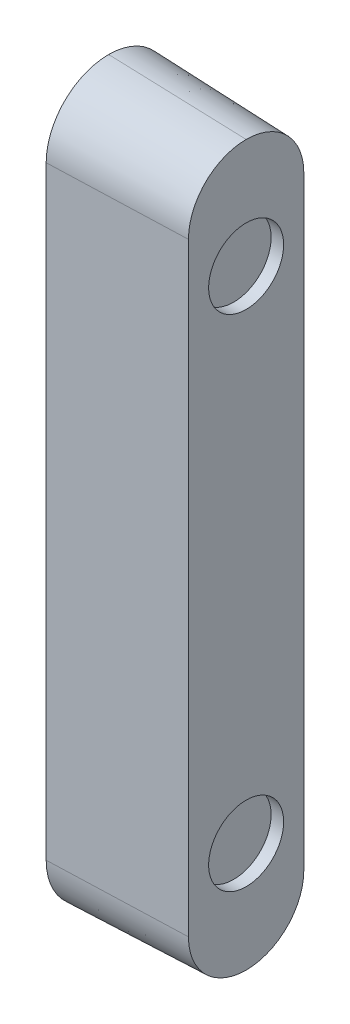
ISO-10303-21;
HEADER;
FILE_DESCRIPTION(('STEP AP214'),'2;1');
FILE_NAME('part.step','',(''),(''),'','','');
FILE_SCHEMA(('AUTOMOTIVE_DESIGN { 1 0 10303 214 1 1 1 1 }'));
ENDSEC;
DATA;
#1=APPLICATION_CONTEXT('core data for automotive mechanical design processes');
#2=APPLICATION_PROTOCOL_DEFINITION('international standard','automotive_design',2000,#1);
#3=PRODUCT_CONTEXT('',#1,'mechanical');
#4=PRODUCT('Part','Part','',(#3));
#5=PRODUCT_RELATED_PRODUCT_CATEGORY('part','',(#4));
#6=PRODUCT_DEFINITION_FORMATION('','',#4);
#7=PRODUCT_DEFINITION_CONTEXT('part definition',#1,'design');
#8=PRODUCT_DEFINITION('design','',#6,#7);
#9=PRODUCT_DEFINITION_SHAPE('','',#8);
#10=(LENGTH_UNIT() NAMED_UNIT(*) SI_UNIT(.MILLI.,.METRE.));
#11=(NAMED_UNIT(*) PLANE_ANGLE_UNIT() SI_UNIT($,.RADIAN.));
#12=(NAMED_UNIT(*) SI_UNIT($,.STERADIAN.) SOLID_ANGLE_UNIT());
#13=UNCERTAINTY_MEASURE_WITH_UNIT(LENGTH_MEASURE(1.E-05),#10,'distance_accuracy_value','');
#14=(GEOMETRIC_REPRESENTATION_CONTEXT(3) GLOBAL_UNCERTAINTY_ASSIGNED_CONTEXT((#13)) GLOBAL_UNIT_ASSIGNED_CONTEXT((#10,
#11,#12)) REPRESENTATION_CONTEXT('',''));
#15=CARTESIAN_POINT('',(0.,0.,0.));
#16=DIRECTION('',(0.,0.,1.));
#17=DIRECTION('',(1.,0.,0.));
#18=AXIS2_PLACEMENT_3D('',#15,#16,#17);
#19=CARTESIAN_POINT('',(-16.5,-87.5,-15.));
#20=DIRECTION('',(0.034899496702501,0.,-0.999390827019096));
#21=DIRECTION('',(-0.999390827019096,0.,-0.034899496702501));
#22=AXIS2_PLACEMENT_3D('',#19,#20,#21);
#23=PLANE('',#22);
#24=CARTESIAN_POINT('',(0.6,0.,-14.4028548416911));
#25=DIRECTION('',(0.034899496702501,0.,-0.999390827019096));
#26=DIRECTION('',(-0.999390827019096,0.,-0.034899496702501));
#27=AXIS2_PLACEMENT_3D('',#24,#25,#26);
#28=ELLIPSE('',#27,4.00243817719529,4.);
#29=CARTESIAN_POINT('',(-3.4,0.,-14.5425379196581));
#30=VERTEX_POINT('',#29);
#31=EDGE_CURVE('E139',#30,#30,#28,.T.);
#32=ORIENTED_EDGE('',*,*,#31,.F.);
#33=EDGE_LOOP('',(#32));
#34=FACE_BOUND('',#33,.T.);
#35=DIRECTION('',(0.,1.,0.));
#36=VECTOR('',#35,1.);
#37=CARTESIAN_POINT('',(-16.5,-87.5,-15.));
#38=LINE('',#37,#36);
#39=CARTESIAN_POINT('',(-16.5,-72.5,-15.));
#40=VERTEX_POINT('',#39);
#41=CARTESIAN_POINT('',(-16.5,72.5,-15.));
#42=VERTEX_POINT('',#41);
#43=EDGE_CURVE('E106',#40,#42,#38,.T.);
#44=ORIENTED_EDGE('',*,*,#43,.T.);
#45=DIRECTION('',(-0.999390827019096,0.,-0.034899496702501));
#46=VECTOR('',#45,1.);
#47=CARTESIAN_POINT('',(-16.5,72.5,-15.));
#48=LINE('',#47,#46);
#49=CARTESIAN_POINT('',(16.5,72.5,-13.8476146067723));
#50=VERTEX_POINT('',#49);
#51=EDGE_CURVE('E110',#42,#50,#48,.F.);
#52=ORIENTED_EDGE('',*,*,#51,.T.);
#53=DIRECTION('',(0.,1.,0.));
#54=VECTOR('',#53,1.);
#55=CARTESIAN_POINT('',(16.5,-87.5,-13.8476146067723));
#56=LINE('',#55,#54);
#57=CARTESIAN_POINT('',(16.5,-72.5,-13.8476146067723));
#58=VERTEX_POINT('',#57);
#59=EDGE_CURVE('E109',#58,#50,#56,.T.);
#60=ORIENTED_EDGE('',*,*,#59,.F.);
#61=DIRECTION('',(-0.999390827019096,0.,-0.034899496702501));
#62=VECTOR('',#61,1.);
#63=CARTESIAN_POINT('',(-16.5,-72.5,-15.));
#64=LINE('',#63,#62);
#65=EDGE_CURVE('E98',#58,#40,#64,.T.);
#66=ORIENTED_EDGE('',*,*,#65,.T.);
#67=EDGE_LOOP('',(#44,#52,#60,#66));
#68=FACE_BOUND('',#67,.T.);
#69=ADVANCED_FACE('F33',(#34,#68),#23,.T.);
#70=CARTESIAN_POINT('',(-16.5,-87.5,15.));
#71=DIRECTION('',(0.034899496702501,0.,0.999390827019096));
#72=DIRECTION('',(0.999390827019096,0.,-0.034899496702501));
#73=AXIS2_PLACEMENT_3D('',#70,#71,#72);
#74=PLANE('',#73);
#75=DIRECTION('',(0.,-1.,0.));
#76=VECTOR('',#75,1.);
#77=CARTESIAN_POINT('',(16.5,-87.5,13.8476146067723));
#78=LINE('',#77,#76);
#79=CARTESIAN_POINT('',(16.5,72.5,13.8476146067723));
#80=VERTEX_POINT('',#79);
#81=CARTESIAN_POINT('',(16.5,-72.5,13.8476146067723));
#82=VERTEX_POINT('',#81);
#83=EDGE_CURVE('E116',#80,#82,#78,.T.);
#84=ORIENTED_EDGE('',*,*,#83,.F.);
#85=DIRECTION('',(-0.999390827019096,0.,0.034899496702501));
#86=VECTOR('',#85,1.);
#87=CARTESIAN_POINT('',(-16.5,72.5,15.));
#88=LINE('',#87,#86);
#89=CARTESIAN_POINT('',(-16.5,72.5,15.));
#90=VERTEX_POINT('',#89);
#91=EDGE_CURVE('E11',#80,#90,#88,.T.);
#92=ORIENTED_EDGE('',*,*,#91,.T.);
#93=DIRECTION('',(0.,-1.,0.));
#94=VECTOR('',#93,1.);
#95=CARTESIAN_POINT('',(-16.5,-87.5,15.));
#96=LINE('',#95,#94);
#97=CARTESIAN_POINT('',(-16.5,-72.5,15.));
#98=VERTEX_POINT('',#97);
#99=EDGE_CURVE('E111',#90,#98,#96,.T.);
#100=ORIENTED_EDGE('',*,*,#99,.T.);
#101=DIRECTION('',(-0.999390827019096,0.,0.034899496702501));
#102=VECTOR('',#101,1.);
#103=CARTESIAN_POINT('',(-16.5,-72.5,15.));
#104=LINE('',#103,#102);
#105=EDGE_CURVE('E37',#98,#82,#104,.F.);
#106=ORIENTED_EDGE('',*,*,#105,.T.);
#107=EDGE_LOOP('',(#84,#92,#100,#106));
#108=FACE_BOUND('',#107,.T.);
#109=ADVANCED_FACE('F169',(#108),#74,.T.);
#110=CARTESIAN_POINT('',(-16.5,0.,0.));
#111=DIRECTION('',(-1.,0.,0.));
#112=DIRECTION('',(0.,0.,1.));
#113=AXIS2_PLACEMENT_3D('',#110,#111,#112);
#114=PLANE('',#113);
#115=CARTESIAN_POINT('',(-16.5,72.5,0.));
#116=DIRECTION('',(-1.,0.,0.));
#117=DIRECTION('',(0.,0.,1.));
#118=AXIS2_PLACEMENT_3D('',#115,#116,#117);
#119=CIRCLE('',#118,15.);
#120=CARTESIAN_POINT('',(-16.5,87.5,0.));
#121=VERTEX_POINT('',#120);
#122=EDGE_CURVE('E51',#90,#121,#119,.T.);
#123=ORIENTED_EDGE('',*,*,#122,.T.);
#124=CARTESIAN_POINT('',(-16.5,72.5,0.));
#125=DIRECTION('',(-1.,0.,0.));
#126=DIRECTION('',(0.,0.,1.));
#127=AXIS2_PLACEMENT_3D('',#124,#125,#126);
#128=CIRCLE('',#127,15.);
#129=EDGE_CURVE('E115',#121,#42,#128,.T.);
#130=ORIENTED_EDGE('',*,*,#129,.T.);
#131=ORIENTED_EDGE('',*,*,#43,.F.);
#132=CARTESIAN_POINT('',(-16.5,-72.5,0.));
#133=DIRECTION('',(-1.,0.,0.));
#134=DIRECTION('',(0.,0.,1.));
#135=AXIS2_PLACEMENT_3D('',#132,#133,#134);
#136=CIRCLE('',#135,15.);
#137=CARTESIAN_POINT('',(-16.5,-87.5,0.));
#138=VERTEX_POINT('',#137);
#139=EDGE_CURVE('E88',#40,#138,#136,.T.);
#140=ORIENTED_EDGE('',*,*,#139,.T.);
#141=CARTESIAN_POINT('',(-16.5,-72.5,0.));
#142=DIRECTION('',(-1.,0.,0.));
#143=DIRECTION('',(0.,0.,1.));
#144=AXIS2_PLACEMENT_3D('',#141,#142,#143);
#145=CIRCLE('',#144,15.);
#146=EDGE_CURVE('E100',#138,#98,#145,.T.);
#147=ORIENTED_EDGE('',*,*,#146,.T.);
#148=ORIENTED_EDGE('',*,*,#99,.F.);
#149=EDGE_LOOP('',(#123,#130,#131,#140,#147,#148));
#150=FACE_BOUND('',#149,.T.);
#151=ADVANCED_FACE('F113',(#150),#114,.T.);
#152=CARTESIAN_POINT('',(16.5,0.,0.));
#153=DIRECTION('',(-1.,0.,0.));
#154=DIRECTION('',(0.,0.,1.));
#155=AXIS2_PLACEMENT_3D('',#152,#153,#154);
#156=PLANE('',#155);
#157=CARTESIAN_POINT('',(16.5,-60.,0.));
#158=DIRECTION('',(1.,0.,0.));
#159=DIRECTION('',(0.,0.,-1.));
#160=AXIS2_PLACEMENT_3D('',#157,#158,#159);
#161=CIRCLE('',#160,9.);
#162=CARTESIAN_POINT('',(16.5,-60.,-9.));
#163=VERTEX_POINT('',#162);
#164=EDGE_CURVE('E149',#163,#163,#161,.T.);
#165=ORIENTED_EDGE('',*,*,#164,.F.);
#166=EDGE_LOOP('',(#165));
#167=FACE_BOUND('',#166,.T.);
#168=CARTESIAN_POINT('',(16.5,60.,0.));
#169=DIRECTION('',(1.,0.,0.));
#170=DIRECTION('',(0.,0.,-1.));
#171=AXIS2_PLACEMENT_3D('',#168,#169,#170);
#172=CIRCLE('',#171,9.);
#173=CARTESIAN_POINT('',(16.5,60.,-9.));
#174=VERTEX_POINT('',#173);
#175=EDGE_CURVE('E121',#174,#174,#172,.T.);
#176=ORIENTED_EDGE('',*,*,#175,.F.);
#177=EDGE_LOOP('',(#176));
#178=FACE_BOUND('',#177,.T.);
#179=ORIENTED_EDGE('',*,*,#59,.T.);
#180=CARTESIAN_POINT('',(16.5,72.5,0.));
#181=DIRECTION('',(-1.,0.,0.));
#182=DIRECTION('',(0.,0.,1.));
#183=AXIS2_PLACEMENT_3D('',#180,#181,#182);
#184=CIRCLE('',#183,13.8476146067723);
#185=CARTESIAN_POINT('',(16.5,86.3476146067723,0.));
#186=VERTEX_POINT('',#185);
#187=EDGE_CURVE('E124',#50,#186,#184,.F.);
#188=ORIENTED_EDGE('',*,*,#187,.T.);
#189=CARTESIAN_POINT('',(16.5,72.5,0.));
#190=DIRECTION('',(-1.,0.,0.));
#191=DIRECTION('',(0.,0.,1.));
#192=AXIS2_PLACEMENT_3D('',#189,#190,#191);
#193=CIRCLE('',#192,13.8476146067723);
#194=EDGE_CURVE('E133',#186,#80,#193,.F.);
#195=ORIENTED_EDGE('',*,*,#194,.T.);
#196=ORIENTED_EDGE('',*,*,#83,.T.);
#197=CARTESIAN_POINT('',(16.5,-72.5,0.));
#198=DIRECTION('',(-1.,0.,0.));
#199=DIRECTION('',(0.,0.,1.));
#200=AXIS2_PLACEMENT_3D('',#197,#198,#199);
#201=CIRCLE('',#200,13.8476146067723);
#202=CARTESIAN_POINT('',(16.5,-86.3476146067723,0.));
#203=VERTEX_POINT('',#202);
#204=EDGE_CURVE('E82',#82,#203,#201,.F.);
#205=ORIENTED_EDGE('',*,*,#204,.T.);
#206=CARTESIAN_POINT('',(16.5,-72.5,0.));
#207=DIRECTION('',(-1.,0.,0.));
#208=DIRECTION('',(0.,0.,1.));
#209=AXIS2_PLACEMENT_3D('',#206,#207,#208);
#210=CIRCLE('',#209,13.8476146067723);
#211=EDGE_CURVE('E131',#203,#58,#210,.F.);
#212=ORIENTED_EDGE('',*,*,#211,.T.);
#213=EDGE_LOOP('',(#179,#188,#195,#196,#205,#212));
#214=FACE_BOUND('',#213,.T.);
#215=ADVANCED_FACE('F192',(#167,#178,#214),#156,.F.);
#216=CARTESIAN_POINT('',(13.5,60.,0.));
#217=DIRECTION('',(1.,0.,0.));
#218=DIRECTION('',(0.,0.,-1.));
#219=AXIS2_PLACEMENT_3D('',#216,#217,#218);
#220=CYLINDRICAL_SURFACE('',#219,9.);
#221=CARTESIAN_POINT('',(13.5,60.,0.));
#222=DIRECTION('',(1.,0.,0.));
#223=DIRECTION('',(0.,0.,-1.));
#224=AXIS2_PLACEMENT_3D('',#221,#222,#223);
#225=CIRCLE('',#224,9.);
#226=CARTESIAN_POINT('',(13.5,60.,-9.));
#227=VERTEX_POINT('',#226);
#228=EDGE_CURVE('E145',#227,#227,#225,.T.);
#229=ORIENTED_EDGE('',*,*,#228,.F.);
#230=EDGE_LOOP('',(#229));
#231=FACE_BOUND('',#230,.T.);
#232=ORIENTED_EDGE('',*,*,#175,.T.);
#233=EDGE_LOOP('',(#232));
#234=FACE_BOUND('',#233,.T.);
#235=ADVANCED_FACE('F233',(#231,#234),#220,.F.);
#236=CARTESIAN_POINT('',(13.5,60.,0.));
#237=DIRECTION('',(1.,0.,0.));
#238=DIRECTION('',(0.,0.,-1.));
#239=AXIS2_PLACEMENT_3D('',#236,#237,#238);
#240=PLANE('',#239);
#241=ORIENTED_EDGE('',*,*,#228,.T.);
#242=EDGE_LOOP('',(#241));
#243=FACE_BOUND('',#242,.T.);
#244=ADVANCED_FACE('F269',(#243),#240,.T.);
#245=CARTESIAN_POINT('',(13.5,-60.,0.));
#246=DIRECTION('',(1.,0.,0.));
#247=DIRECTION('',(0.,0.,-1.));
#248=AXIS2_PLACEMENT_3D('',#245,#246,#247);
#249=CYLINDRICAL_SURFACE('',#248,9.);
#250=CARTESIAN_POINT('',(13.5,-60.,0.));
#251=DIRECTION('',(1.,0.,0.));
#252=DIRECTION('',(0.,0.,-1.));
#253=AXIS2_PLACEMENT_3D('',#250,#251,#252);
#254=CIRCLE('',#253,9.);
#255=CARTESIAN_POINT('',(13.5,-60.,-9.));
#256=VERTEX_POINT('',#255);
#257=EDGE_CURVE('E135',#256,#256,#254,.T.);
#258=ORIENTED_EDGE('',*,*,#257,.F.);
#259=EDGE_LOOP('',(#258));
#260=FACE_BOUND('',#259,.T.);
#261=ORIENTED_EDGE('',*,*,#164,.T.);
#262=EDGE_LOOP('',(#261));
#263=FACE_BOUND('',#262,.T.);
#264=ADVANCED_FACE('F187',(#260,#263),#249,.F.);
#265=CARTESIAN_POINT('',(13.5,-60.,0.));
#266=DIRECTION('',(1.,0.,0.));
#267=DIRECTION('',(0.,0.,-1.));
#268=AXIS2_PLACEMENT_3D('',#265,#266,#267);
#269=PLANE('',#268);
#270=ORIENTED_EDGE('',*,*,#257,.T.);
#271=EDGE_LOOP('',(#270));
#272=FACE_BOUND('',#271,.T.);
#273=ADVANCED_FACE('F182',(#272),#269,.T.);
#274=CARTESIAN_POINT('',(-16.5,72.5,0.));
#275=DIRECTION('',(-1.,0.,0.));
#276=DIRECTION('',(0.,0.,1.));
#277=AXIS2_PLACEMENT_3D('',#274,#275,#276);
#278=CONICAL_SURFACE('',#277,15.,0.0349065850398866);
#279=DIRECTION('',(-0.999390827019096,0.034899496702501,0.));
#280=VECTOR('',#279,1.);
#281=CARTESIAN_POINT('',(-16.5,87.5,0.));
#282=LINE('',#281,#280);
#283=EDGE_CURVE('E128',#121,#186,#282,.F.);
#284=ORIENTED_EDGE('',*,*,#283,.F.);
#285=ORIENTED_EDGE('',*,*,#122,.F.);
#286=ORIENTED_EDGE('',*,*,#91,.F.);
#287=ORIENTED_EDGE('',*,*,#194,.F.);
#288=EDGE_LOOP('',(#284,#285,#286,#287));
#289=FACE_BOUND('',#288,.T.);
#290=ADVANCED_FACE('F180',(#289),#278,.T.);
#291=CARTESIAN_POINT('',(-16.5,72.5,0.));
#292=DIRECTION('',(-1.,0.,0.));
#293=DIRECTION('',(0.,0.,1.));
#294=AXIS2_PLACEMENT_3D('',#291,#292,#293);
#295=CONICAL_SURFACE('',#294,15.,0.0349065850398866);
#296=ORIENTED_EDGE('',*,*,#129,.F.);
#297=ORIENTED_EDGE('',*,*,#283,.T.);
#298=ORIENTED_EDGE('',*,*,#187,.F.);
#299=ORIENTED_EDGE('',*,*,#51,.F.);
#300=EDGE_LOOP('',(#296,#297,#298,#299));
#301=FACE_BOUND('',#300,.T.);
#302=ADVANCED_FACE('F177',(#301),#295,.T.);
#303=CARTESIAN_POINT('',(-16.5,-72.5,0.));
#304=DIRECTION('',(-1.,0.,0.));
#305=DIRECTION('',(0.,0.,1.));
#306=AXIS2_PLACEMENT_3D('',#303,#304,#305);
#307=CONICAL_SURFACE('',#306,15.,0.0349065850398866);
#308=ORIENTED_EDGE('',*,*,#105,.F.);
#309=ORIENTED_EDGE('',*,*,#146,.F.);
#310=DIRECTION('',(-0.999390827019096,-0.034899496702501,0.));
#311=VECTOR('',#310,1.);
#312=CARTESIAN_POINT('',(-16.5,-87.5,0.));
#313=LINE('',#312,#311);
#314=EDGE_CURVE('E99',#203,#138,#313,.T.);
#315=ORIENTED_EDGE('',*,*,#314,.F.);
#316=ORIENTED_EDGE('',*,*,#204,.F.);
#317=EDGE_LOOP('',(#308,#309,#315,#316));
#318=FACE_BOUND('',#317,.T.);
#319=ADVANCED_FACE('F35',(#318),#307,.T.);
#320=CARTESIAN_POINT('',(-16.5,-72.5,0.));
#321=DIRECTION('',(-1.,0.,0.));
#322=DIRECTION('',(0.,0.,1.));
#323=AXIS2_PLACEMENT_3D('',#320,#321,#322);
#324=CONICAL_SURFACE('',#323,15.,0.0349065850398866);
#325=ORIENTED_EDGE('',*,*,#139,.F.);
#326=ORIENTED_EDGE('',*,*,#65,.F.);
#327=ORIENTED_EDGE('',*,*,#211,.F.);
#328=ORIENTED_EDGE('',*,*,#314,.T.);
#329=EDGE_LOOP('',(#325,#326,#327,#328));
#330=FACE_BOUND('',#329,.T.);
#331=ADVANCED_FACE('F96',(#330),#324,.T.);
#332=CARTESIAN_POINT('',(0.6,0.,-11.));
#333=DIRECTION('',(0.,0.,-1.));
#334=DIRECTION('',(-1.,0.,0.));
#335=AXIS2_PLACEMENT_3D('',#332,#333,#334);
#336=CYLINDRICAL_SURFACE('',#335,4.);
#337=CARTESIAN_POINT('',(0.6,0.,-11.));
#338=DIRECTION('',(0.,0.,-1.));
#339=DIRECTION('',(-1.,0.,0.));
#340=AXIS2_PLACEMENT_3D('',#337,#338,#339);
#341=CIRCLE('',#340,4.);
#342=CARTESIAN_POINT('',(-3.4,0.,-11.));
#343=VERTEX_POINT('',#342);
#344=EDGE_CURVE('E129',#343,#343,#341,.T.);
#345=ORIENTED_EDGE('',*,*,#344,.F.);
#346=EDGE_LOOP('',(#345));
#347=FACE_BOUND('',#346,.T.);
#348=ORIENTED_EDGE('',*,*,#31,.T.);
#349=EDGE_LOOP('',(#348));
#350=FACE_BOUND('',#349,.T.);
#351=ADVANCED_FACE('F162',(#347,#350),#336,.F.);
#352=CARTESIAN_POINT('',(0.6,0.,-11.));
#353=DIRECTION('',(0.,0.,-1.));
#354=DIRECTION('',(-1.,0.,0.));
#355=AXIS2_PLACEMENT_3D('',#352,#353,#354);
#356=PLANE('',#355);
#357=ORIENTED_EDGE('',*,*,#344,.T.);
#358=EDGE_LOOP('',(#357));
#359=FACE_BOUND('',#358,.T.);
#360=ADVANCED_FACE('F160',(#359),#356,.T.);
#361=CLOSED_SHELL('',(#69,#109,#151,#215,#235,#244,#264,#273,#290,#302,#319,#331,#351,#360));
#362=MANIFOLD_SOLID_BREP('B2',#361);
#363=ADVANCED_BREP_SHAPE_REPRESENTATION('',(#18,#362),#14);
#364=SHAPE_DEFINITION_REPRESENTATION(#9,#363);
ENDSEC;
END-ISO-10303-21;
